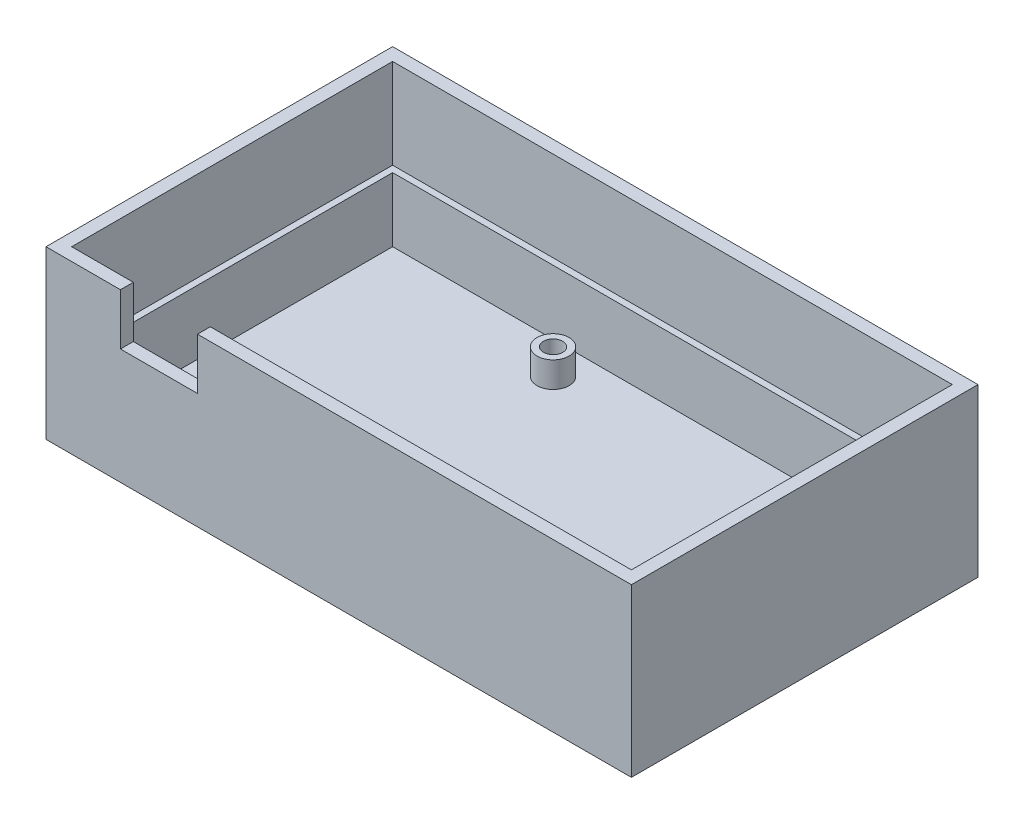
ISO-10303-21;
HEADER;
FILE_DESCRIPTION(('STEP AP214'),'2;1');
FILE_NAME('part.step','',(''),(''),'','','');
FILE_SCHEMA(('AUTOMOTIVE_DESIGN { 1 0 10303 214 1 1 1 1 }'));
ENDSEC;
DATA;
#1=APPLICATION_CONTEXT('core data for automotive mechanical design processes');
#2=APPLICATION_PROTOCOL_DEFINITION('international standard','automotive_design',2000,#1);
#3=PRODUCT_CONTEXT('',#1,'mechanical');
#4=PRODUCT('Part','Part','',(#3));
#5=PRODUCT_RELATED_PRODUCT_CATEGORY('part','',(#4));
#6=PRODUCT_DEFINITION_FORMATION('','',#4);
#7=PRODUCT_DEFINITION_CONTEXT('part definition',#1,'design');
#8=PRODUCT_DEFINITION('design','',#6,#7);
#9=PRODUCT_DEFINITION_SHAPE('','',#8);
#10=(LENGTH_UNIT() NAMED_UNIT(*) SI_UNIT(.MILLI.,.METRE.));
#11=(NAMED_UNIT(*) PLANE_ANGLE_UNIT() SI_UNIT($,.RADIAN.));
#12=(NAMED_UNIT(*) SI_UNIT($,.STERADIAN.) SOLID_ANGLE_UNIT());
#13=UNCERTAINTY_MEASURE_WITH_UNIT(LENGTH_MEASURE(1.E-05),#10,'distance_accuracy_value','');
#14=(GEOMETRIC_REPRESENTATION_CONTEXT(3) GLOBAL_UNCERTAINTY_ASSIGNED_CONTEXT((#13)) GLOBAL_UNIT_ASSIGNED_CONTEXT((#10,
#11,#12)) REPRESENTATION_CONTEXT('',''));
#15=CARTESIAN_POINT('',(0.,0.,0.));
#16=DIRECTION('',(0.,0.,1.));
#17=DIRECTION('',(1.,0.,0.));
#18=AXIS2_PLACEMENT_3D('',#15,#16,#17);
#19=CARTESIAN_POINT('',(0.,2.,0.));
#20=DIRECTION('',(0.,-1.,0.));
#21=DIRECTION('',(0.,0.,-1.));
#22=AXIS2_PLACEMENT_3D('',#19,#20,#21);
#23=PLANE('',#22);
#24=DIRECTION('',(-1.,0.,0.));
#25=VECTOR('',#24,1.);
#26=CARTESIAN_POINT('',(-39.6,2.,-24.));
#27=LINE('',#26,#25);
#28=CARTESIAN_POINT('',(45.6,2.,-24.));
#29=VERTEX_POINT('',#28);
#30=CARTESIAN_POINT('',(-39.6,2.,-24.));
#31=VERTEX_POINT('',#30);
#32=EDGE_CURVE('E203',#29,#31,#27,.T.);
#33=ORIENTED_EDGE('',*,*,#32,.T.);
#34=DIRECTION('',(0.,0.,1.));
#35=VECTOR('',#34,1.);
#36=CARTESIAN_POINT('',(-39.6,2.,-24.));
#37=LINE('',#36,#35);
#38=CARTESIAN_POINT('',(-39.6,2.,24.));
#39=VERTEX_POINT('',#38);
#40=EDGE_CURVE('E194',#31,#39,#37,.T.);
#41=ORIENTED_EDGE('',*,*,#40,.T.);
#42=DIRECTION('',(1.,0.,0.));
#43=VECTOR('',#42,1.);
#44=CARTESIAN_POINT('',(-39.6,2.,24.));
#45=LINE('',#44,#43);
#46=CARTESIAN_POINT('',(45.6,2.,24.));
#47=VERTEX_POINT('',#46);
#48=EDGE_CURVE('E197',#39,#47,#45,.T.);
#49=ORIENTED_EDGE('',*,*,#48,.T.);
#50=DIRECTION('',(0.,0.,-1.));
#51=VECTOR('',#50,1.);
#52=CARTESIAN_POINT('',(45.6,2.,-24.));
#53=LINE('',#52,#51);
#54=EDGE_CURVE('E200',#47,#29,#53,.T.);
#55=ORIENTED_EDGE('',*,*,#54,.T.);
#56=EDGE_LOOP('',(#33,#41,#49,#55));
#57=FACE_BOUND('',#56,.T.);
#58=CARTESIAN_POINT('',(33.4,2.,19.));
#59=DIRECTION('',(0.,-1.,0.));
#60=DIRECTION('',(0.,0.,-1.));
#61=AXIS2_PLACEMENT_3D('',#58,#59,#60);
#62=CIRCLE('',#61,2.5);
#63=CARTESIAN_POINT('',(33.4,2.,16.5));
#64=VERTEX_POINT('',#63);
#65=EDGE_CURVE('E293',#64,#64,#62,.F.);
#66=ORIENTED_EDGE('',*,*,#65,.F.);
#67=EDGE_LOOP('',(#66));
#68=FACE_BOUND('',#67,.T.);
#69=CARTESIAN_POINT('',(33.4,2.,-19.));
#70=DIRECTION('',(0.,-1.,0.));
#71=DIRECTION('',(0.,0.,-1.));
#72=AXIS2_PLACEMENT_3D('',#69,#70,#71);
#73=CIRCLE('',#72,2.5);
#74=CARTESIAN_POINT('',(33.4,2.,-21.5));
#75=VERTEX_POINT('',#74);
#76=EDGE_CURVE('E290',#75,#75,#73,.F.);
#77=ORIENTED_EDGE('',*,*,#76,.F.);
#78=EDGE_LOOP('',(#77));
#79=FACE_BOUND('',#78,.T.);
#80=CARTESIAN_POINT('',(-9.59999999999999,2.,-19.));
#81=DIRECTION('',(0.,-1.,0.));
#82=DIRECTION('',(0.,0.,-1.));
#83=AXIS2_PLACEMENT_3D('',#80,#81,#82);
#84=CIRCLE('',#83,2.5);
#85=CARTESIAN_POINT('',(-9.59999999999999,2.,-21.5));
#86=VERTEX_POINT('',#85);
#87=EDGE_CURVE('E287',#86,#86,#84,.F.);
#88=ORIENTED_EDGE('',*,*,#87,.F.);
#89=EDGE_LOOP('',(#88));
#90=FACE_BOUND('',#89,.T.);
#91=CARTESIAN_POINT('',(-9.59999999999999,2.,19.));
#92=DIRECTION('',(0.,-1.,0.));
#93=DIRECTION('',(0.,0.,-1.));
#94=AXIS2_PLACEMENT_3D('',#91,#92,#93);
#95=CIRCLE('',#94,2.5);
#96=CARTESIAN_POINT('',(-9.59999999999999,2.,16.5));
#97=VERTEX_POINT('',#96);
#98=EDGE_CURVE('E284',#97,#97,#95,.F.);
#99=ORIENTED_EDGE('',*,*,#98,.F.);
#100=EDGE_LOOP('',(#99));
#101=FACE_BOUND('',#100,.T.);
#102=ADVANCED_FACE('F33',(#57,#68,#79,#90,#101),#23,.F.);
#103=CARTESIAN_POINT('',(-9.59999999999999,6.,19.));
#104=DIRECTION('',(0.,-1.,0.));
#105=DIRECTION('',(0.,0.,-1.));
#106=AXIS2_PLACEMENT_3D('',#103,#104,#105);
#107=CYLINDRICAL_SURFACE('',#106,2.5);
#108=CARTESIAN_POINT('',(-9.59999999999999,6.,19.));
#109=DIRECTION('',(0.,1.,0.));
#110=DIRECTION('',(0.,0.,1.));
#111=AXIS2_PLACEMENT_3D('',#108,#109,#110);
#112=CIRCLE('',#111,2.5);
#113=CARTESIAN_POINT('',(-9.59999999999999,6.,21.5));
#114=VERTEX_POINT('',#113);
#115=EDGE_CURVE('E260',#114,#114,#112,.T.);
#116=ORIENTED_EDGE('',*,*,#115,.F.);
#117=EDGE_LOOP('',(#116));
#118=FACE_BOUND('',#117,.T.);
#119=ORIENTED_EDGE('',*,*,#98,.T.);
#120=EDGE_LOOP('',(#119));
#121=FACE_BOUND('',#120,.T.);
#122=ADVANCED_FACE('F331',(#118,#121),#107,.T.);
#123=CARTESIAN_POINT('',(-9.59999999999999,6.,19.));
#124=DIRECTION('',(0.,1.,0.));
#125=DIRECTION('',(0.,0.,1.));
#126=AXIS2_PLACEMENT_3D('',#123,#124,#125);
#127=PLANE('',#126);
#128=CARTESIAN_POINT('',(-9.59999999999999,6.,19.));
#129=DIRECTION('',(0.,1.,0.));
#130=DIRECTION('',(0.,0.,1.));
#131=AXIS2_PLACEMENT_3D('',#128,#129,#130);
#132=CIRCLE('',#131,1.5);
#133=CARTESIAN_POINT('',(-9.59999999999999,6.,20.5));
#134=VERTEX_POINT('',#133);
#135=EDGE_CURVE('E231',#134,#134,#132,.T.);
#136=ORIENTED_EDGE('',*,*,#135,.F.);
#137=EDGE_LOOP('',(#136));
#138=FACE_BOUND('',#137,.T.);
#139=ORIENTED_EDGE('',*,*,#115,.T.);
#140=EDGE_LOOP('',(#139));
#141=FACE_BOUND('',#140,.T.);
#142=ADVANCED_FACE('F337',(#138,#141),#127,.T.);
#143=CARTESIAN_POINT('',(-9.59999999999999,6.,-19.));
#144=DIRECTION('',(0.,-1.,0.));
#145=DIRECTION('',(0.,0.,-1.));
#146=AXIS2_PLACEMENT_3D('',#143,#144,#145);
#147=CYLINDRICAL_SURFACE('',#146,2.5);
#148=CARTESIAN_POINT('',(-9.59999999999999,6.,-19.));
#149=DIRECTION('',(0.,1.,0.));
#150=DIRECTION('',(0.,0.,-1.));
#151=AXIS2_PLACEMENT_3D('',#148,#149,#150);
#152=CIRCLE('',#151,2.5);
#153=CARTESIAN_POINT('',(-9.59999999999999,6.,-21.5));
#154=VERTEX_POINT('',#153);
#155=EDGE_CURVE('E257',#154,#154,#152,.T.);
#156=ORIENTED_EDGE('',*,*,#155,.F.);
#157=EDGE_LOOP('',(#156));
#158=FACE_BOUND('',#157,.T.);
#159=ORIENTED_EDGE('',*,*,#87,.T.);
#160=EDGE_LOOP('',(#159));
#161=FACE_BOUND('',#160,.T.);
#162=ADVANCED_FACE('F410',(#158,#161),#147,.T.);
#163=CARTESIAN_POINT('',(-9.59999999999999,6.,-19.));
#164=DIRECTION('',(0.,-1.,0.));
#165=DIRECTION('',(0.,0.,-1.));
#166=AXIS2_PLACEMENT_3D('',#163,#164,#165);
#167=PLANE('',#166);
#168=CARTESIAN_POINT('',(-9.59999999999999,6.,-19.));
#169=DIRECTION('',(0.,1.,0.));
#170=DIRECTION('',(0.,0.,1.));
#171=AXIS2_PLACEMENT_3D('',#168,#169,#170);
#172=CIRCLE('',#171,1.5);
#173=CARTESIAN_POINT('',(-9.59999999999999,6.,-17.5));
#174=VERTEX_POINT('',#173);
#175=EDGE_CURVE('E227',#174,#174,#172,.T.);
#176=ORIENTED_EDGE('',*,*,#175,.F.);
#177=EDGE_LOOP('',(#176));
#178=FACE_BOUND('',#177,.T.);
#179=ORIENTED_EDGE('',*,*,#155,.T.);
#180=EDGE_LOOP('',(#179));
#181=FACE_BOUND('',#180,.T.);
#182=ADVANCED_FACE('F406',(#178,#181),#167,.F.);
#183=CARTESIAN_POINT('',(33.4,6.,-19.));
#184=DIRECTION('',(0.,-1.,0.));
#185=DIRECTION('',(0.,0.,-1.));
#186=AXIS2_PLACEMENT_3D('',#183,#184,#185);
#187=CYLINDRICAL_SURFACE('',#186,2.5);
#188=CARTESIAN_POINT('',(33.4,6.,-19.));
#189=DIRECTION('',(0.,1.,0.));
#190=DIRECTION('',(0.,0.,1.));
#191=AXIS2_PLACEMENT_3D('',#188,#189,#190);
#192=CIRCLE('',#191,2.5);
#193=CARTESIAN_POINT('',(33.4,6.,-16.5));
#194=VERTEX_POINT('',#193);
#195=EDGE_CURVE('E254',#194,#194,#192,.T.);
#196=ORIENTED_EDGE('',*,*,#195,.F.);
#197=EDGE_LOOP('',(#196));
#198=FACE_BOUND('',#197,.T.);
#199=ORIENTED_EDGE('',*,*,#76,.T.);
#200=EDGE_LOOP('',(#199));
#201=FACE_BOUND('',#200,.T.);
#202=ADVANCED_FACE('F402',(#198,#201),#187,.T.);
#203=CARTESIAN_POINT('',(33.4,6.,-19.));
#204=DIRECTION('',(0.,1.,0.));
#205=DIRECTION('',(0.,0.,1.));
#206=AXIS2_PLACEMENT_3D('',#203,#204,#205);
#207=PLANE('',#206);
#208=CARTESIAN_POINT('',(33.4,6.,-19.));
#209=DIRECTION('',(0.,1.,0.));
#210=DIRECTION('',(0.,0.,1.));
#211=AXIS2_PLACEMENT_3D('',#208,#209,#210);
#212=CIRCLE('',#211,1.5);
#213=CARTESIAN_POINT('',(33.4,6.,-17.5));
#214=VERTEX_POINT('',#213);
#215=EDGE_CURVE('E238',#214,#214,#212,.T.);
#216=ORIENTED_EDGE('',*,*,#215,.F.);
#217=EDGE_LOOP('',(#216));
#218=FACE_BOUND('',#217,.T.);
#219=ORIENTED_EDGE('',*,*,#195,.T.);
#220=EDGE_LOOP('',(#219));
#221=FACE_BOUND('',#220,.T.);
#222=ADVANCED_FACE('F398',(#218,#221),#207,.T.);
#223=CARTESIAN_POINT('',(33.4,6.,19.));
#224=DIRECTION('',(0.,-1.,0.));
#225=DIRECTION('',(0.,0.,-1.));
#226=AXIS2_PLACEMENT_3D('',#223,#224,#225);
#227=CYLINDRICAL_SURFACE('',#226,2.5);
#228=CARTESIAN_POINT('',(33.4,6.,19.));
#229=DIRECTION('',(0.,1.,0.));
#230=DIRECTION('',(0.,0.,1.));
#231=AXIS2_PLACEMENT_3D('',#228,#229,#230);
#232=CIRCLE('',#231,2.5);
#233=CARTESIAN_POINT('',(33.4,6.,21.5));
#234=VERTEX_POINT('',#233);
#235=EDGE_CURVE('E249',#234,#234,#232,.T.);
#236=ORIENTED_EDGE('',*,*,#235,.F.);
#237=EDGE_LOOP('',(#236));
#238=FACE_BOUND('',#237,.T.);
#239=ORIENTED_EDGE('',*,*,#65,.T.);
#240=EDGE_LOOP('',(#239));
#241=FACE_BOUND('',#240,.T.);
#242=ADVANCED_FACE('F394',(#238,#241),#227,.T.);
#243=CARTESIAN_POINT('',(33.4,6.,19.));
#244=DIRECTION('',(0.,1.,0.));
#245=DIRECTION('',(0.,0.,1.));
#246=AXIS2_PLACEMENT_3D('',#243,#244,#245);
#247=PLANE('',#246);
#248=CARTESIAN_POINT('',(33.4,6.,19.));
#249=DIRECTION('',(0.,1.,0.));
#250=DIRECTION('',(0.,0.,1.));
#251=AXIS2_PLACEMENT_3D('',#248,#249,#250);
#252=CIRCLE('',#251,1.5);
#253=CARTESIAN_POINT('',(33.4,6.,20.5));
#254=VERTEX_POINT('',#253);
#255=EDGE_CURVE('E232',#254,#254,#252,.T.);
#256=ORIENTED_EDGE('',*,*,#255,.F.);
#257=EDGE_LOOP('',(#256));
#258=FACE_BOUND('',#257,.T.);
#259=ORIENTED_EDGE('',*,*,#235,.T.);
#260=EDGE_LOOP('',(#259));
#261=FACE_BOUND('',#260,.T.);
#262=ADVANCED_FACE('F367',(#258,#261),#247,.T.);
#263=CARTESIAN_POINT('',(33.4,2.,19.));
#264=DIRECTION('',(0.,1.,0.));
#265=DIRECTION('',(0.,0.,1.));
#266=AXIS2_PLACEMENT_3D('',#263,#264,#265);
#267=CYLINDRICAL_SURFACE('',#266,1.5);
#268=CARTESIAN_POINT('',(33.4,2.,19.));
#269=DIRECTION('',(0.,1.,0.));
#270=DIRECTION('',(0.,0.,1.));
#271=AXIS2_PLACEMENT_3D('',#268,#269,#270);
#272=CIRCLE('',#271,1.5);
#273=CARTESIAN_POINT('',(33.4,2.,20.5));
#274=VERTEX_POINT('',#273);
#275=EDGE_CURVE('E228',#274,#274,#272,.T.);
#276=ORIENTED_EDGE('',*,*,#275,.F.);
#277=EDGE_LOOP('',(#276));
#278=FACE_BOUND('',#277,.T.);
#279=ORIENTED_EDGE('',*,*,#255,.T.);
#280=EDGE_LOOP('',(#279));
#281=FACE_BOUND('',#280,.T.);
#282=ADVANCED_FACE('F363',(#278,#281),#267,.F.);
#283=CARTESIAN_POINT('',(33.4,2.,19.));
#284=DIRECTION('',(0.,1.,0.));
#285=DIRECTION('',(0.,0.,1.));
#286=AXIS2_PLACEMENT_3D('',#283,#284,#285);
#287=PLANE('',#286);
#288=ORIENTED_EDGE('',*,*,#275,.T.);
#289=EDGE_LOOP('',(#288));
#290=FACE_BOUND('',#289,.T.);
#291=ADVANCED_FACE('F359',(#290),#287,.T.);
#292=CARTESIAN_POINT('',(33.4,2.,-19.));
#293=DIRECTION('',(0.,1.,0.));
#294=DIRECTION('',(0.,0.,1.));
#295=AXIS2_PLACEMENT_3D('',#292,#293,#294);
#296=CYLINDRICAL_SURFACE('',#295,1.5);
#297=CARTESIAN_POINT('',(33.4,2.,-19.));
#298=DIRECTION('',(0.,1.,0.));
#299=DIRECTION('',(0.,0.,1.));
#300=AXIS2_PLACEMENT_3D('',#297,#298,#299);
#301=CIRCLE('',#300,1.5);
#302=CARTESIAN_POINT('',(33.4,2.,-17.5));
#303=VERTEX_POINT('',#302);
#304=EDGE_CURVE('E235',#303,#303,#301,.T.);
#305=ORIENTED_EDGE('',*,*,#304,.F.);
#306=EDGE_LOOP('',(#305));
#307=FACE_BOUND('',#306,.T.);
#308=ORIENTED_EDGE('',*,*,#215,.T.);
#309=EDGE_LOOP('',(#308));
#310=FACE_BOUND('',#309,.T.);
#311=ADVANCED_FACE('F362',(#307,#310),#296,.F.);
#312=CARTESIAN_POINT('',(33.4,2.,-19.));
#313=DIRECTION('',(0.,1.,0.));
#314=DIRECTION('',(0.,0.,1.));
#315=AXIS2_PLACEMENT_3D('',#312,#313,#314);
#316=PLANE('',#315);
#317=ORIENTED_EDGE('',*,*,#304,.T.);
#318=EDGE_LOOP('',(#317));
#319=FACE_BOUND('',#318,.T.);
#320=ADVANCED_FACE('F369',(#319),#316,.T.);
#321=CARTESIAN_POINT('',(-9.59999999999999,2.,-19.));
#322=DIRECTION('',(0.,1.,0.));
#323=DIRECTION('',(0.,0.,1.));
#324=AXIS2_PLACEMENT_3D('',#321,#322,#323);
#325=CYLINDRICAL_SURFACE('',#324,1.5);
#326=CARTESIAN_POINT('',(-9.59999999999999,2.,-19.));
#327=DIRECTION('',(0.,1.,0.));
#328=DIRECTION('',(0.,0.,1.));
#329=AXIS2_PLACEMENT_3D('',#326,#327,#328);
#330=CIRCLE('',#329,1.5);
#331=CARTESIAN_POINT('',(-9.59999999999999,2.,-17.5));
#332=VERTEX_POINT('',#331);
#333=EDGE_CURVE('E241',#332,#332,#330,.T.);
#334=ORIENTED_EDGE('',*,*,#333,.F.);
#335=EDGE_LOOP('',(#334));
#336=FACE_BOUND('',#335,.T.);
#337=ORIENTED_EDGE('',*,*,#175,.T.);
#338=EDGE_LOOP('',(#337));
#339=FACE_BOUND('',#338,.T.);
#340=ADVANCED_FACE('F372',(#336,#339),#325,.F.);
#341=CARTESIAN_POINT('',(-9.59999999999999,2.,-19.));
#342=DIRECTION('',(0.,1.,0.));
#343=DIRECTION('',(0.,0.,1.));
#344=AXIS2_PLACEMENT_3D('',#341,#342,#343);
#345=PLANE('',#344);
#346=ORIENTED_EDGE('',*,*,#333,.T.);
#347=EDGE_LOOP('',(#346));
#348=FACE_BOUND('',#347,.T.);
#349=ADVANCED_FACE('F377',(#348),#345,.T.);
#350=CARTESIAN_POINT('',(-9.59999999999999,2.,19.));
#351=DIRECTION('',(0.,1.,0.));
#352=DIRECTION('',(0.,0.,1.));
#353=AXIS2_PLACEMENT_3D('',#350,#351,#352);
#354=CYLINDRICAL_SURFACE('',#353,1.5);
#355=CARTESIAN_POINT('',(-9.59999999999999,2.,19.));
#356=DIRECTION('',(0.,1.,0.));
#357=DIRECTION('',(0.,0.,1.));
#358=AXIS2_PLACEMENT_3D('',#355,#356,#357);
#359=CIRCLE('',#358,1.5);
#360=CARTESIAN_POINT('',(-9.59999999999999,2.,20.5));
#361=VERTEX_POINT('',#360);
#362=EDGE_CURVE('E246',#361,#361,#359,.T.);
#363=ORIENTED_EDGE('',*,*,#362,.F.);
#364=EDGE_LOOP('',(#363));
#365=FACE_BOUND('',#364,.T.);
#366=ORIENTED_EDGE('',*,*,#135,.T.);
#367=EDGE_LOOP('',(#366));
#368=FACE_BOUND('',#367,.T.);
#369=ADVANCED_FACE('F380',(#365,#368),#354,.F.);
#370=CARTESIAN_POINT('',(-9.59999999999999,2.,19.));
#371=DIRECTION('',(0.,1.,0.));
#372=DIRECTION('',(0.,0.,1.));
#373=AXIS2_PLACEMENT_3D('',#370,#371,#372);
#374=PLANE('',#373);
#375=ORIENTED_EDGE('',*,*,#362,.T.);
#376=EDGE_LOOP('',(#375));
#377=FACE_BOUND('',#376,.T.);
#378=ADVANCED_FACE('F385',(#377),#374,.T.);
#379=CARTESIAN_POINT('',(-39.6,26.,-24.));
#380=DIRECTION('',(1.,0.,0.));
#381=DIRECTION('',(0.,0.,-1.));
#382=AXIS2_PLACEMENT_3D('',#379,#380,#381);
#383=PLANE('',#382);
#384=DIRECTION('',(0.,0.,-1.));
#385=VECTOR('',#384,1.);
#386=CARTESIAN_POINT('',(-39.6,12.,-24.));
#387=LINE('',#386,#385);
#388=CARTESIAN_POINT('',(-39.6,12.,24.));
#389=VERTEX_POINT('',#388);
#390=CARTESIAN_POINT('',(-39.6,12.,-24.));
#391=VERTEX_POINT('',#390);
#392=EDGE_CURVE('E192',#389,#391,#387,.T.);
#393=ORIENTED_EDGE('',*,*,#392,.F.);
#394=DIRECTION('',(0.,-1.,0.));
#395=VECTOR('',#394,1.);
#396=CARTESIAN_POINT('',(-39.6,26.,24.));
#397=LINE('',#396,#395);
#398=EDGE_CURVE('E212',#389,#39,#397,.T.);
#399=ORIENTED_EDGE('',*,*,#398,.T.);
#400=ORIENTED_EDGE('',*,*,#40,.F.);
#401=DIRECTION('',(0.,-1.,0.));
#402=VECTOR('',#401,1.);
#403=CARTESIAN_POINT('',(-39.6,26.,-24.));
#404=LINE('',#403,#402);
#405=EDGE_CURVE('E206',#391,#31,#404,.T.);
#406=ORIENTED_EDGE('',*,*,#405,.F.);
#407=EDGE_LOOP('',(#393,#399,#400,#406));
#408=FACE_BOUND('',#407,.T.);
#409=ADVANCED_FACE('F357',(#408),#383,.T.);
#410=CARTESIAN_POINT('',(-39.6,26.,24.));
#411=DIRECTION('',(0.,0.,-1.));
#412=DIRECTION('',(-1.,0.,0.));
#413=AXIS2_PLACEMENT_3D('',#410,#411,#412);
#414=PLANE('',#413);
#415=DIRECTION('',(-1.,0.,0.));
#416=VECTOR('',#415,1.);
#417=CARTESIAN_POINT('',(-39.6,12.,24.));
#418=LINE('',#417,#416);
#419=CARTESIAN_POINT('',(45.6,12.,24.));
#420=VERTEX_POINT('',#419);
#421=EDGE_CURVE('E190',#420,#389,#418,.T.);
#422=ORIENTED_EDGE('',*,*,#421,.F.);
#423=DIRECTION('',(0.,-1.,0.));
#424=VECTOR('',#423,1.);
#425=CARTESIAN_POINT('',(45.6,26.,24.));
#426=LINE('',#425,#424);
#427=EDGE_CURVE('E210',#420,#47,#426,.T.);
#428=ORIENTED_EDGE('',*,*,#427,.T.);
#429=ORIENTED_EDGE('',*,*,#48,.F.);
#430=ORIENTED_EDGE('',*,*,#398,.F.);
#431=EDGE_LOOP('',(#422,#428,#429,#430));
#432=FACE_BOUND('',#431,.T.);
#433=ADVANCED_FACE('F489',(#432),#414,.T.);
#434=CARTESIAN_POINT('',(45.6,26.,-24.));
#435=DIRECTION('',(-1.,0.,0.));
#436=DIRECTION('',(0.,0.,1.));
#437=AXIS2_PLACEMENT_3D('',#434,#435,#436);
#438=PLANE('',#437);
#439=DIRECTION('',(0.,0.,1.));
#440=VECTOR('',#439,1.);
#441=CARTESIAN_POINT('',(45.6,12.,-24.));
#442=LINE('',#441,#440);
#443=CARTESIAN_POINT('',(45.6,12.,-24.));
#444=VERTEX_POINT('',#443);
#445=EDGE_CURVE('E181',#444,#420,#442,.T.);
#446=ORIENTED_EDGE('',*,*,#445,.F.);
#447=DIRECTION('',(0.,-1.,0.));
#448=VECTOR('',#447,1.);
#449=CARTESIAN_POINT('',(45.6,26.,-24.));
#450=LINE('',#449,#448);
#451=EDGE_CURVE('E208',#444,#29,#450,.T.);
#452=ORIENTED_EDGE('',*,*,#451,.T.);
#453=ORIENTED_EDGE('',*,*,#54,.F.);
#454=ORIENTED_EDGE('',*,*,#427,.F.);
#455=EDGE_LOOP('',(#446,#452,#453,#454));
#456=FACE_BOUND('',#455,.T.);
#457=ADVANCED_FACE('F496',(#456),#438,.T.);
#458=CARTESIAN_POINT('',(-39.6,26.,-24.));
#459=DIRECTION('',(0.,0.,1.));
#460=DIRECTION('',(1.,0.,0.));
#461=AXIS2_PLACEMENT_3D('',#458,#459,#460);
#462=PLANE('',#461);
#463=DIRECTION('',(1.,0.,0.));
#464=VECTOR('',#463,1.);
#465=CARTESIAN_POINT('',(-39.6,12.,-24.));
#466=LINE('',#465,#464);
#467=EDGE_CURVE('E151',#391,#444,#466,.T.);
#468=ORIENTED_EDGE('',*,*,#467,.F.);
#469=ORIENTED_EDGE('',*,*,#405,.T.);
#470=ORIENTED_EDGE('',*,*,#32,.F.);
#471=ORIENTED_EDGE('',*,*,#451,.F.);
#472=EDGE_LOOP('',(#468,#469,#470,#471));
#473=FACE_BOUND('',#472,.T.);
#474=ADVANCED_FACE('F503',(#473),#462,.T.);
#475=CARTESIAN_POINT('',(-40.6,12.,25.));
#476=DIRECTION('',(-1.,0.,0.));
#477=DIRECTION('',(0.,0.,1.));
#478=AXIS2_PLACEMENT_3D('',#475,#476,#477);
#479=PLANE('',#478);
#480=DIRECTION('',(0.,0.,1.));
#481=VECTOR('',#480,1.);
#482=CARTESIAN_POINT('',(-40.6,26.,25.));
#483=LINE('',#482,#481);
#484=CARTESIAN_POINT('',(-40.6,26.,-25.));
#485=VERTEX_POINT('',#484);
#486=CARTESIAN_POINT('',(-40.6,26.,25.));
#487=VERTEX_POINT('',#486);
#488=EDGE_CURVE('E56',#485,#487,#483,.T.);
#489=ORIENTED_EDGE('',*,*,#488,.T.);
#490=DIRECTION('',(0.,1.,0.));
#491=VECTOR('',#490,1.);
#492=CARTESIAN_POINT('',(-40.6,12.,25.));
#493=LINE('',#492,#491);
#494=CARTESIAN_POINT('',(-40.6,12.,25.));
#495=VERTEX_POINT('',#494);
#496=EDGE_CURVE('E186',#495,#487,#493,.T.);
#497=ORIENTED_EDGE('',*,*,#496,.F.);
#498=DIRECTION('',(0.,0.,1.));
#499=VECTOR('',#498,1.);
#500=CARTESIAN_POINT('',(-40.6,12.,25.));
#501=LINE('',#500,#499);
#502=CARTESIAN_POINT('',(-40.6,12.,-25.));
#503=VERTEX_POINT('',#502);
#504=EDGE_CURVE('E178',#503,#495,#501,.T.);
#505=ORIENTED_EDGE('',*,*,#504,.F.);
#506=DIRECTION('',(0.,1.,0.));
#507=VECTOR('',#506,1.);
#508=CARTESIAN_POINT('',(-40.6,12.,-25.));
#509=LINE('',#508,#507);
#510=EDGE_CURVE('E179',#503,#485,#509,.T.);
#511=ORIENTED_EDGE('',*,*,#510,.T.);
#512=EDGE_LOOP('',(#489,#497,#505,#511));
#513=FACE_BOUND('',#512,.T.);
#514=ADVANCED_FACE('F511',(#513),#479,.F.);
#515=CARTESIAN_POINT('',(-40.6,12.,-25.));
#516=DIRECTION('',(0.,0.,-1.));
#517=DIRECTION('',(-1.,0.,0.));
#518=AXIS2_PLACEMENT_3D('',#515,#516,#517);
#519=PLANE('',#518);
#520=DIRECTION('',(-1.,0.,0.));
#521=VECTOR('',#520,1.);
#522=CARTESIAN_POINT('',(-40.6,26.,-25.));
#523=LINE('',#522,#521);
#524=CARTESIAN_POINT('',(46.6,26.,-25.));
#525=VERTEX_POINT('',#524);
#526=EDGE_CURVE('E175',#525,#485,#523,.T.);
#527=ORIENTED_EDGE('',*,*,#526,.T.);
#528=ORIENTED_EDGE('',*,*,#510,.F.);
#529=DIRECTION('',(-1.,0.,0.));
#530=VECTOR('',#529,1.);
#531=CARTESIAN_POINT('',(-40.6,12.,-25.));
#532=LINE('',#531,#530);
#533=CARTESIAN_POINT('',(46.6,12.,-25.));
#534=VERTEX_POINT('',#533);
#535=EDGE_CURVE('E188',#534,#503,#532,.T.);
#536=ORIENTED_EDGE('',*,*,#535,.F.);
#537=DIRECTION('',(0.,1.,0.));
#538=VECTOR('',#537,1.);
#539=CARTESIAN_POINT('',(46.6,12.,-25.));
#540=LINE('',#539,#538);
#541=EDGE_CURVE('E182',#534,#525,#540,.T.);
#542=ORIENTED_EDGE('',*,*,#541,.T.);
#543=EDGE_LOOP('',(#527,#528,#536,#542));
#544=FACE_BOUND('',#543,.T.);
#545=ADVANCED_FACE('F519',(#544),#519,.F.);
#546=CARTESIAN_POINT('',(46.6,12.,25.));
#547=DIRECTION('',(1.,0.,0.));
#548=DIRECTION('',(0.,0.,-1.));
#549=AXIS2_PLACEMENT_3D('',#546,#547,#548);
#550=PLANE('',#549);
#551=DIRECTION('',(0.,0.,-1.));
#552=VECTOR('',#551,1.);
#553=CARTESIAN_POINT('',(46.6,26.,25.));
#554=LINE('',#553,#552);
#555=CARTESIAN_POINT('',(46.6,26.,25.));
#556=VERTEX_POINT('',#555);
#557=EDGE_CURVE('E168',#556,#525,#554,.T.);
#558=ORIENTED_EDGE('',*,*,#557,.T.);
#559=ORIENTED_EDGE('',*,*,#541,.F.);
#560=DIRECTION('',(0.,0.,-1.));
#561=VECTOR('',#560,1.);
#562=CARTESIAN_POINT('',(46.6,12.,25.));
#563=LINE('',#562,#561);
#564=CARTESIAN_POINT('',(46.6,12.,25.));
#565=VERTEX_POINT('',#564);
#566=EDGE_CURVE('E682',#565,#534,#563,.T.);
#567=ORIENTED_EDGE('',*,*,#566,.F.);
#568=DIRECTION('',(0.,1.,0.));
#569=VECTOR('',#568,1.);
#570=CARTESIAN_POINT('',(46.6,12.,25.));
#571=LINE('',#570,#569);
#572=EDGE_CURVE('E184',#565,#556,#571,.T.);
#573=ORIENTED_EDGE('',*,*,#572,.T.);
#574=EDGE_LOOP('',(#558,#559,#567,#573));
#575=FACE_BOUND('',#574,.T.);
#576=ADVANCED_FACE('F526',(#575),#550,.F.);
#577=CARTESIAN_POINT('',(-40.6,12.,25.));
#578=DIRECTION('',(0.,0.,1.));
#579=DIRECTION('',(1.,0.,0.));
#580=AXIS2_PLACEMENT_3D('',#577,#578,#579);
#581=PLANE('',#580);
#582=DIRECTION('',(1.,0.,0.));
#583=VECTOR('',#582,1.);
#584=CARTESIAN_POINT('',(-40.6,26.,25.));
#585=LINE('',#584,#583);
#586=CARTESIAN_POINT('',(-31.,26.,25.));
#587=VERTEX_POINT('',#586);
#588=EDGE_CURVE('E169',#487,#587,#585,.T.);
#589=ORIENTED_EDGE('',*,*,#588,.T.);
#590=DIRECTION('',(0.,-1.,0.));
#591=VECTOR('',#590,1.);
#592=CARTESIAN_POINT('',(-31.,12.,25.));
#593=LINE('',#592,#591);
#594=CARTESIAN_POINT('',(-31.,18.,25.));
#595=VERTEX_POINT('',#594);
#596=EDGE_CURVE('E301',#587,#595,#593,.T.);
#597=ORIENTED_EDGE('',*,*,#596,.T.);
#598=DIRECTION('',(-1.,0.,0.));
#599=VECTOR('',#598,1.);
#600=CARTESIAN_POINT('',(-40.6,18.,25.));
#601=LINE('',#600,#599);
#602=CARTESIAN_POINT('',(-19.,18.,25.));
#603=VERTEX_POINT('',#602);
#604=EDGE_CURVE('E160',#603,#595,#601,.T.);
#605=ORIENTED_EDGE('',*,*,#604,.F.);
#606=DIRECTION('',(0.,1.,0.));
#607=VECTOR('',#606,1.);
#608=CARTESIAN_POINT('',(-19.,12.,25.));
#609=LINE('',#608,#607);
#610=CARTESIAN_POINT('',(-19.,26.,25.));
#611=VERTEX_POINT('',#610);
#612=EDGE_CURVE('E146',#603,#611,#609,.T.);
#613=ORIENTED_EDGE('',*,*,#612,.T.);
#614=EDGE_CURVE('E157',#611,#556,#585,.T.);
#615=ORIENTED_EDGE('',*,*,#614,.T.);
#616=ORIENTED_EDGE('',*,*,#572,.F.);
#617=DIRECTION('',(1.,0.,0.));
#618=VECTOR('',#617,1.);
#619=CARTESIAN_POINT('',(-40.6,12.,25.));
#620=LINE('',#619,#618);
#621=EDGE_CURVE('E679',#495,#565,#620,.T.);
#622=ORIENTED_EDGE('',*,*,#621,.F.);
#623=ORIENTED_EDGE('',*,*,#496,.T.);
#624=EDGE_LOOP('',(#589,#597,#605,#613,#615,#616,#622,#623));
#625=FACE_BOUND('',#624,.T.);
#626=ADVANCED_FACE('F156',(#625),#581,.F.);
#627=CARTESIAN_POINT('',(0.,12.,0.));
#628=DIRECTION('',(0.,-1.,0.));
#629=DIRECTION('',(0.,0.,-1.));
#630=AXIS2_PLACEMENT_3D('',#627,#628,#629);
#631=PLANE('',#630);
#632=ORIENTED_EDGE('',*,*,#392,.T.);
#633=ORIENTED_EDGE('',*,*,#467,.T.);
#634=ORIENTED_EDGE('',*,*,#445,.T.);
#635=ORIENTED_EDGE('',*,*,#421,.T.);
#636=EDGE_LOOP('',(#632,#633,#634,#635));
#637=FACE_BOUND('',#636,.T.);
#638=ORIENTED_EDGE('',*,*,#504,.T.);
#639=ORIENTED_EDGE('',*,*,#621,.T.);
#640=ORIENTED_EDGE('',*,*,#566,.T.);
#641=ORIENTED_EDGE('',*,*,#535,.T.);
#642=EDGE_LOOP('',(#638,#639,#640,#641));
#643=FACE_BOUND('',#642,.T.);
#644=ADVANCED_FACE('F327',(#637,#643),#631,.F.);
#645=CARTESIAN_POINT('',(0.,0.,0.));
#646=DIRECTION('',(0.,-1.,0.));
#647=DIRECTION('',(0.,0.,-1.));
#648=AXIS2_PLACEMENT_3D('',#645,#646,#647);
#649=PLANE('',#648);
#650=DIRECTION('',(0.,0.,-1.));
#651=VECTOR('',#650,1.);
#652=CARTESIAN_POINT('',(48.6,0.,27.));
#653=LINE('',#652,#651);
#654=CARTESIAN_POINT('',(48.6,0.,27.));
#655=VERTEX_POINT('',#654);
#656=CARTESIAN_POINT('',(48.6,0.,-27.));
#657=VERTEX_POINT('',#656);
#658=EDGE_CURVE('E263',#655,#657,#653,.T.);
#659=ORIENTED_EDGE('',*,*,#658,.F.);
#660=DIRECTION('',(1.,0.,0.));
#661=VECTOR('',#660,1.);
#662=CARTESIAN_POINT('',(-42.6,0.,27.));
#663=LINE('',#662,#661);
#664=CARTESIAN_POINT('',(-42.6,0.,27.));
#665=VERTEX_POINT('',#664);
#666=EDGE_CURVE('E270',#665,#655,#663,.T.);
#667=ORIENTED_EDGE('',*,*,#666,.F.);
#668=DIRECTION('',(0.,0.,1.));
#669=VECTOR('',#668,1.);
#670=CARTESIAN_POINT('',(-42.6,0.,27.));
#671=LINE('',#670,#669);
#672=CARTESIAN_POINT('',(-42.6,0.,-27.));
#673=VERTEX_POINT('',#672);
#674=EDGE_CURVE('E268',#673,#665,#671,.T.);
#675=ORIENTED_EDGE('',*,*,#674,.F.);
#676=DIRECTION('',(-1.,0.,0.));
#677=VECTOR('',#676,1.);
#678=CARTESIAN_POINT('',(-42.6,0.,-27.));
#679=LINE('',#678,#677);
#680=EDGE_CURVE('E266',#657,#673,#679,.T.);
#681=ORIENTED_EDGE('',*,*,#680,.F.);
#682=EDGE_LOOP('',(#659,#667,#675,#681));
#683=FACE_BOUND('',#682,.T.);
#684=ADVANCED_FACE('F317',(#683),#649,.T.);
#685=CARTESIAN_POINT('',(-42.6,2.,-27.));
#686=DIRECTION('',(0.,0.,1.));
#687=DIRECTION('',(1.,0.,0.));
#688=AXIS2_PLACEMENT_3D('',#685,#686,#687);
#689=PLANE('',#688);
#690=ORIENTED_EDGE('',*,*,#680,.T.);
#691=DIRECTION('',(0.,-1.,0.));
#692=VECTOR('',#691,1.);
#693=CARTESIAN_POINT('',(-42.6,2.,-27.));
#694=LINE('',#693,#692);
#695=CARTESIAN_POINT('',(-42.6,26.,-27.));
#696=VERTEX_POINT('',#695);
#697=EDGE_CURVE('E278',#696,#673,#694,.T.);
#698=ORIENTED_EDGE('',*,*,#697,.F.);
#699=DIRECTION('',(-1.,0.,0.));
#700=VECTOR('',#699,1.);
#701=CARTESIAN_POINT('',(-42.6,26.,-27.));
#702=LINE('',#701,#700);
#703=CARTESIAN_POINT('',(48.6,26.,-27.));
#704=VERTEX_POINT('',#703);
#705=EDGE_CURVE('E224',#704,#696,#702,.T.);
#706=ORIENTED_EDGE('',*,*,#705,.F.);
#707=DIRECTION('',(0.,-1.,0.));
#708=VECTOR('',#707,1.);
#709=CARTESIAN_POINT('',(48.6,2.,-27.));
#710=LINE('',#709,#708);
#711=EDGE_CURVE('E281',#704,#657,#710,.T.);
#712=ORIENTED_EDGE('',*,*,#711,.T.);
#713=EDGE_LOOP('',(#690,#698,#706,#712));
#714=FACE_BOUND('',#713,.T.);
#715=ADVANCED_FACE('F321',(#714),#689,.F.);
#716=CARTESIAN_POINT('',(48.6,2.,27.));
#717=DIRECTION('',(-1.,0.,0.));
#718=DIRECTION('',(0.,0.,1.));
#719=AXIS2_PLACEMENT_3D('',#716,#717,#718);
#720=PLANE('',#719);
#721=ORIENTED_EDGE('',*,*,#658,.T.);
#722=ORIENTED_EDGE('',*,*,#711,.F.);
#723=DIRECTION('',(0.,0.,-1.));
#724=VECTOR('',#723,1.);
#725=CARTESIAN_POINT('',(48.6,26.,-27.));
#726=LINE('',#725,#724);
#727=CARTESIAN_POINT('',(48.6,26.,27.));
#728=VERTEX_POINT('',#727);
#729=EDGE_CURVE('E221',#728,#704,#726,.T.);
#730=ORIENTED_EDGE('',*,*,#729,.F.);
#731=DIRECTION('',(0.,-1.,0.));
#732=VECTOR('',#731,1.);
#733=CARTESIAN_POINT('',(48.6,2.,27.));
#734=LINE('',#733,#732);
#735=EDGE_CURVE('E272',#728,#655,#734,.T.);
#736=ORIENTED_EDGE('',*,*,#735,.T.);
#737=EDGE_LOOP('',(#721,#722,#730,#736));
#738=FACE_BOUND('',#737,.T.);
#739=ADVANCED_FACE('F35',(#738),#720,.F.);
#740=CARTESIAN_POINT('',(-42.6,2.,27.));
#741=DIRECTION('',(0.,0.,-1.));
#742=DIRECTION('',(-1.,0.,0.));
#743=AXIS2_PLACEMENT_3D('',#740,#741,#742);
#744=PLANE('',#743);
#745=DIRECTION('',(1.,0.,0.));
#746=VECTOR('',#745,1.);
#747=CARTESIAN_POINT('',(-42.6,18.,27.));
#748=LINE('',#747,#746);
#749=CARTESIAN_POINT('',(-31.,18.,27.));
#750=VERTEX_POINT('',#749);
#751=CARTESIAN_POINT('',(-19.,18.,27.));
#752=VERTEX_POINT('',#751);
#753=EDGE_CURVE('E11',#750,#752,#748,.T.);
#754=ORIENTED_EDGE('',*,*,#753,.F.);
#755=DIRECTION('',(0.,1.,0.));
#756=VECTOR('',#755,1.);
#757=CARTESIAN_POINT('',(-31.,2.,27.));
#758=LINE('',#757,#756);
#759=CARTESIAN_POINT('',(-31.,26.,27.));
#760=VERTEX_POINT('',#759);
#761=EDGE_CURVE('E161',#750,#760,#758,.T.);
#762=ORIENTED_EDGE('',*,*,#761,.T.);
#763=DIRECTION('',(1.,0.,0.));
#764=VECTOR('',#763,1.);
#765=CARTESIAN_POINT('',(-42.6,26.,27.));
#766=LINE('',#765,#764);
#767=CARTESIAN_POINT('',(-42.6,26.,27.));
#768=VERTEX_POINT('',#767);
#769=EDGE_CURVE('E218',#768,#760,#766,.T.);
#770=ORIENTED_EDGE('',*,*,#769,.F.);
#771=DIRECTION('',(0.,-1.,0.));
#772=VECTOR('',#771,1.);
#773=CARTESIAN_POINT('',(-42.6,2.,27.));
#774=LINE('',#773,#772);
#775=EDGE_CURVE('E275',#768,#665,#774,.T.);
#776=ORIENTED_EDGE('',*,*,#775,.T.);
#777=ORIENTED_EDGE('',*,*,#666,.T.);
#778=ORIENTED_EDGE('',*,*,#735,.F.);
#779=CARTESIAN_POINT('',(-19.,26.,27.));
#780=VERTEX_POINT('',#779);
#781=EDGE_CURVE('E217',#780,#728,#766,.T.);
#782=ORIENTED_EDGE('',*,*,#781,.F.);
#783=DIRECTION('',(0.,-1.,0.));
#784=VECTOR('',#783,1.);
#785=CARTESIAN_POINT('',(-19.,2.,27.));
#786=LINE('',#785,#784);
#787=EDGE_CURVE('E48',#780,#752,#786,.T.);
#788=ORIENTED_EDGE('',*,*,#787,.T.);
#789=EDGE_LOOP('',(#754,#762,#770,#776,#777,#778,#782,#788));
#790=FACE_BOUND('',#789,.T.);
#791=ADVANCED_FACE('F306',(#790),#744,.F.);
#792=CARTESIAN_POINT('',(-42.6,2.,27.));
#793=DIRECTION('',(1.,0.,0.));
#794=DIRECTION('',(0.,0.,-1.));
#795=AXIS2_PLACEMENT_3D('',#792,#793,#794);
#796=PLANE('',#795);
#797=ORIENTED_EDGE('',*,*,#674,.T.);
#798=ORIENTED_EDGE('',*,*,#775,.F.);
#799=DIRECTION('',(0.,0.,1.));
#800=VECTOR('',#799,1.);
#801=CARTESIAN_POINT('',(-42.6,26.,-27.));
#802=LINE('',#801,#800);
#803=EDGE_CURVE('E214',#696,#768,#802,.T.);
#804=ORIENTED_EDGE('',*,*,#803,.F.);
#805=ORIENTED_EDGE('',*,*,#697,.T.);
#806=EDGE_LOOP('',(#797,#798,#804,#805));
#807=FACE_BOUND('',#806,.T.);
#808=ADVANCED_FACE('F311',(#807),#796,.F.);
#809=CARTESIAN_POINT('',(0.,26.,0.));
#810=DIRECTION('',(0.,1.,0.));
#811=DIRECTION('',(0.,0.,1.));
#812=AXIS2_PLACEMENT_3D('',#809,#810,#811);
#813=PLANE('',#812);
#814=DIRECTION('',(0.,0.,1.));
#815=VECTOR('',#814,1.);
#816=CARTESIAN_POINT('',(-31.,26.,0.));
#817=LINE('',#816,#815);
#818=EDGE_CURVE('E41',#587,#760,#817,.T.);
#819=ORIENTED_EDGE('',*,*,#818,.F.);
#820=ORIENTED_EDGE('',*,*,#588,.F.);
#821=ORIENTED_EDGE('',*,*,#488,.F.);
#822=ORIENTED_EDGE('',*,*,#526,.F.);
#823=ORIENTED_EDGE('',*,*,#557,.F.);
#824=ORIENTED_EDGE('',*,*,#614,.F.);
#825=DIRECTION('',(0.,0.,-1.));
#826=VECTOR('',#825,1.);
#827=CARTESIAN_POINT('',(-19.,26.,0.));
#828=LINE('',#827,#826);
#829=EDGE_CURVE('E143',#780,#611,#828,.T.);
#830=ORIENTED_EDGE('',*,*,#829,.F.);
#831=ORIENTED_EDGE('',*,*,#781,.T.);
#832=ORIENTED_EDGE('',*,*,#729,.T.);
#833=ORIENTED_EDGE('',*,*,#705,.T.);
#834=ORIENTED_EDGE('',*,*,#803,.T.);
#835=ORIENTED_EDGE('',*,*,#769,.T.);
#836=EDGE_LOOP('',(#819,#820,#821,#822,#823,#824,#830,#831,#832,#833,#834,#835));
#837=FACE_BOUND('',#836,.T.);
#838=ADVANCED_FACE('F165',(#837),#813,.T.);
#839=CARTESIAN_POINT('',(0.,18.,0.));
#840=DIRECTION('',(0.,1.,0.));
#841=DIRECTION('',(0.,0.,1.));
#842=AXIS2_PLACEMENT_3D('',#839,#840,#841);
#843=PLANE('',#842);
#844=ORIENTED_EDGE('',*,*,#604,.T.);
#845=DIRECTION('',(0.,0.,1.));
#846=VECTOR('',#845,1.);
#847=CARTESIAN_POINT('',(-31.,18.,35.5));
#848=LINE('',#847,#846);
#849=EDGE_CURVE('E692',#595,#750,#848,.T.);
#850=ORIENTED_EDGE('',*,*,#849,.T.);
#851=ORIENTED_EDGE('',*,*,#753,.T.);
#852=DIRECTION('',(0.,0.,-1.));
#853=VECTOR('',#852,1.);
#854=CARTESIAN_POINT('',(-19.,18.,35.5));
#855=LINE('',#854,#853);
#856=EDGE_CURVE('E690',#752,#603,#855,.T.);
#857=ORIENTED_EDGE('',*,*,#856,.T.);
#858=EDGE_LOOP('',(#844,#850,#851,#857));
#859=FACE_BOUND('',#858,.T.);
#860=ADVANCED_FACE('F348',(#859),#843,.T.);
#861=CARTESIAN_POINT('',(-31.,18.,35.5));
#862=DIRECTION('',(-1.,0.,0.));
#863=DIRECTION('',(0.,0.,1.));
#864=AXIS2_PLACEMENT_3D('',#861,#862,#863);
#865=PLANE('',#864);
#866=ORIENTED_EDGE('',*,*,#818,.T.);
#867=ORIENTED_EDGE('',*,*,#761,.F.);
#868=ORIENTED_EDGE('',*,*,#849,.F.);
#869=ORIENTED_EDGE('',*,*,#596,.F.);
#870=EDGE_LOOP('',(#866,#867,#868,#869));
#871=FACE_BOUND('',#870,.T.);
#872=ADVANCED_FACE('F298',(#871),#865,.F.);
#873=CARTESIAN_POINT('',(-19.,18.,35.5));
#874=DIRECTION('',(1.,0.,0.));
#875=DIRECTION('',(0.,0.,-1.));
#876=AXIS2_PLACEMENT_3D('',#873,#874,#875);
#877=PLANE('',#876);
#878=ORIENTED_EDGE('',*,*,#856,.F.);
#879=ORIENTED_EDGE('',*,*,#787,.F.);
#880=ORIENTED_EDGE('',*,*,#829,.T.);
#881=ORIENTED_EDGE('',*,*,#612,.F.);
#882=EDGE_LOOP('',(#878,#879,#880,#881));
#883=FACE_BOUND('',#882,.T.);
#884=ADVANCED_FACE('F145',(#883),#877,.F.);
#885=CLOSED_SHELL('',(#102,#122,#142,#162,#182,#202,#222,#242,#262,#282,#291,#311,#320,#340,
#349,#369,#378,#409,#433,#457,#474,#514,#545,#576,#626,#644,#684,#715,#739,#791,#808,#838,#860,
#872,#884));
#886=MANIFOLD_SOLID_BREP('B2',#885);
#887=ADVANCED_BREP_SHAPE_REPRESENTATION('',(#18,#886),#14);
#888=SHAPE_DEFINITION_REPRESENTATION(#9,#887);
ENDSEC;
END-ISO-10303-21;
